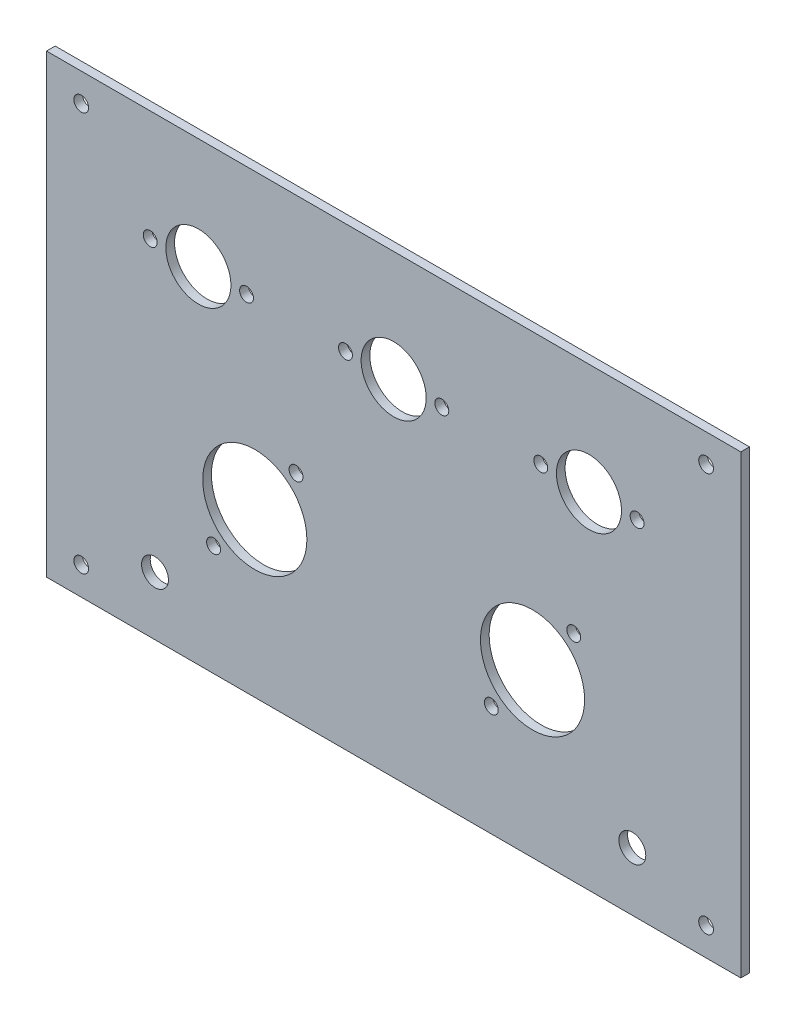
ISO-10303-21;
HEADER;
FILE_DESCRIPTION(('STEP AP214'),'2;1');
FILE_NAME('part.step','',(''),(''),'','','');
FILE_SCHEMA(('AUTOMOTIVE_DESIGN { 1 0 10303 214 1 1 1 1 }'));
ENDSEC;
DATA;
#1=APPLICATION_CONTEXT('core data for automotive mechanical design processes');
#2=APPLICATION_PROTOCOL_DEFINITION('international standard','automotive_design',2000,#1);
#3=PRODUCT_CONTEXT('',#1,'mechanical');
#4=PRODUCT('Part','Part','',(#3));
#5=PRODUCT_RELATED_PRODUCT_CATEGORY('part','',(#4));
#6=PRODUCT_DEFINITION_FORMATION('','',#4);
#7=PRODUCT_DEFINITION_CONTEXT('part definition',#1,'design');
#8=PRODUCT_DEFINITION('design','',#6,#7);
#9=PRODUCT_DEFINITION_SHAPE('','',#8);
#10=(LENGTH_UNIT() NAMED_UNIT(*) SI_UNIT(.MILLI.,.METRE.));
#11=(NAMED_UNIT(*) PLANE_ANGLE_UNIT() SI_UNIT($,.RADIAN.));
#12=(NAMED_UNIT(*) SI_UNIT($,.STERADIAN.) SOLID_ANGLE_UNIT());
#13=UNCERTAINTY_MEASURE_WITH_UNIT(LENGTH_MEASURE(1.E-05),#10,'distance_accuracy_value','');
#14=(GEOMETRIC_REPRESENTATION_CONTEXT(3) GLOBAL_UNCERTAINTY_ASSIGNED_CONTEXT((#13)) GLOBAL_UNIT_ASSIGNED_CONTEXT((#10,
#11,#12)) REPRESENTATION_CONTEXT('',''));
#15=CARTESIAN_POINT('',(0.,0.,0.));
#16=DIRECTION('',(0.,0.,1.));
#17=DIRECTION('',(1.,0.,0.));
#18=AXIS2_PLACEMENT_3D('',#15,#16,#17);
#19=CARTESIAN_POINT('',(0.,0.,2.));
#20=DIRECTION('',(0.,0.,1.));
#21=DIRECTION('',(1.,0.,0.));
#22=AXIS2_PLACEMENT_3D('',#19,#20,#21);
#23=PLANE('',#22);
#24=CARTESIAN_POINT('',(72.,46.,2.));
#25=DIRECTION('',(0.,0.,1.));
#26=DIRECTION('',(1.,0.,0.));
#27=AXIS2_PLACEMENT_3D('',#24,#25,#26);
#28=CIRCLE('',#27,1.7);
#29=CARTESIAN_POINT('',(73.7,46.,2.));
#30=VERTEX_POINT('',#29);
#31=EDGE_CURVE('E170',#30,#30,#28,.T.);
#32=ORIENTED_EDGE('',*,*,#31,.F.);
#33=EDGE_LOOP('',(#32));
#34=FACE_BOUND('',#33,.T.);
#35=CARTESIAN_POINT('',(72.,-46.,2.));
#36=DIRECTION('',(0.,0.,1.));
#37=DIRECTION('',(1.,0.,0.));
#38=AXIS2_PLACEMENT_3D('',#35,#36,#37);
#39=CIRCLE('',#38,1.7);
#40=CARTESIAN_POINT('',(73.7,-46.,2.));
#41=VERTEX_POINT('',#40);
#42=EDGE_CURVE('E167',#41,#41,#39,.T.);
#43=ORIENTED_EDGE('',*,*,#42,.F.);
#44=EDGE_LOOP('',(#43));
#45=FACE_BOUND('',#44,.T.);
#46=CARTESIAN_POINT('',(-72.,46.,2.));
#47=DIRECTION('',(0.,0.,1.));
#48=DIRECTION('',(1.,0.,0.));
#49=AXIS2_PLACEMENT_3D('',#46,#47,#48);
#50=CIRCLE('',#49,1.7);
#51=CARTESIAN_POINT('',(-70.3,46.,2.));
#52=VERTEX_POINT('',#51);
#53=EDGE_CURVE('E164',#52,#52,#50,.T.);
#54=ORIENTED_EDGE('',*,*,#53,.F.);
#55=EDGE_LOOP('',(#54));
#56=FACE_BOUND('',#55,.T.);
#57=CARTESIAN_POINT('',(-72.,-46.,2.));
#58=DIRECTION('',(0.,0.,1.));
#59=DIRECTION('',(1.,0.,0.));
#60=AXIS2_PLACEMENT_3D('',#57,#58,#59);
#61=CIRCLE('',#60,1.7);
#62=CARTESIAN_POINT('',(-70.3,-46.,2.));
#63=VERTEX_POINT('',#62);
#64=EDGE_CURVE('E160',#63,#63,#61,.T.);
#65=ORIENTED_EDGE('',*,*,#64,.F.);
#66=EDGE_LOOP('',(#65));
#67=FACE_BOUND('',#66,.T.);
#68=CARTESIAN_POINT('',(55.,-39.,2.));
#69=DIRECTION('',(0.,0.,1.));
#70=DIRECTION('',(1.,0.,0.));
#71=AXIS2_PLACEMENT_3D('',#68,#69,#70);
#72=CIRCLE('',#71,3.1);
#73=CARTESIAN_POINT('',(58.1,-39.,2.));
#74=VERTEX_POINT('',#73);
#75=EDGE_CURVE('E156',#74,#74,#72,.T.);
#76=ORIENTED_EDGE('',*,*,#75,.F.);
#77=EDGE_LOOP('',(#76));
#78=FACE_BOUND('',#77,.T.);
#79=CARTESIAN_POINT('',(-55.,-39.,2.));
#80=DIRECTION('',(0.,0.,1.));
#81=DIRECTION('',(1.,0.,0.));
#82=AXIS2_PLACEMENT_3D('',#79,#80,#81);
#83=CIRCLE('',#82,3.1);
#84=CARTESIAN_POINT('',(-51.9,-39.,2.));
#85=VERTEX_POINT('',#84);
#86=EDGE_CURVE('E152',#85,#85,#83,.T.);
#87=ORIENTED_EDGE('',*,*,#86,.F.);
#88=EDGE_LOOP('',(#87));
#89=FACE_BOUND('',#88,.T.);
#90=CARTESIAN_POINT('',(41.5,-3.,2.));
#91=DIRECTION('',(0.,0.,1.));
#92=DIRECTION('',(1.,0.,0.));
#93=AXIS2_PLACEMENT_3D('',#90,#91,#92);
#94=CIRCLE('',#93,1.6);
#95=CARTESIAN_POINT('',(43.1,-3.,2.));
#96=VERTEX_POINT('',#95);
#97=EDGE_CURVE('E148',#96,#96,#94,.T.);
#98=ORIENTED_EDGE('',*,*,#97,.F.);
#99=EDGE_LOOP('',(#98));
#100=FACE_BOUND('',#99,.T.);
#101=CARTESIAN_POINT('',(22.5,-27.,2.));
#102=DIRECTION('',(0.,0.,1.));
#103=DIRECTION('',(1.,0.,0.));
#104=AXIS2_PLACEMENT_3D('',#101,#102,#103);
#105=CIRCLE('',#104,1.6);
#106=CARTESIAN_POINT('',(24.1,-27.,2.));
#107=VERTEX_POINT('',#106);
#108=EDGE_CURVE('E144',#107,#107,#105,.T.);
#109=ORIENTED_EDGE('',*,*,#108,.F.);
#110=EDGE_LOOP('',(#109));
#111=FACE_BOUND('',#110,.T.);
#112=CARTESIAN_POINT('',(32.,-15.,2.));
#113=DIRECTION('',(0.,0.,1.));
#114=DIRECTION('',(1.,0.,0.));
#115=AXIS2_PLACEMENT_3D('',#112,#113,#114);
#116=CIRCLE('',#115,12.);
#117=CARTESIAN_POINT('',(44.,-15.,2.));
#118=VERTEX_POINT('',#117);
#119=EDGE_CURVE('E140',#118,#118,#116,.T.);
#120=ORIENTED_EDGE('',*,*,#119,.F.);
#121=EDGE_LOOP('',(#120));
#122=FACE_BOUND('',#121,.T.);
#123=CARTESIAN_POINT('',(-22.5,-3.,2.));
#124=DIRECTION('',(0.,0.,1.));
#125=DIRECTION('',(1.,0.,0.));
#126=AXIS2_PLACEMENT_3D('',#123,#124,#125);
#127=CIRCLE('',#126,1.6);
#128=CARTESIAN_POINT('',(-20.9,-3.,2.));
#129=VERTEX_POINT('',#128);
#130=EDGE_CURVE('E136',#129,#129,#127,.T.);
#131=ORIENTED_EDGE('',*,*,#130,.F.);
#132=EDGE_LOOP('',(#131));
#133=FACE_BOUND('',#132,.T.);
#134=CARTESIAN_POINT('',(-41.5,-27.,2.));
#135=DIRECTION('',(0.,0.,1.));
#136=DIRECTION('',(1.,0.,0.));
#137=AXIS2_PLACEMENT_3D('',#134,#135,#136);
#138=CIRCLE('',#137,1.6);
#139=CARTESIAN_POINT('',(-39.9,-27.,2.));
#140=VERTEX_POINT('',#139);
#141=EDGE_CURVE('E132',#140,#140,#138,.T.);
#142=ORIENTED_EDGE('',*,*,#141,.F.);
#143=EDGE_LOOP('',(#142));
#144=FACE_BOUND('',#143,.T.);
#145=CARTESIAN_POINT('',(-32.,-15.,2.));
#146=DIRECTION('',(0.,0.,1.));
#147=DIRECTION('',(1.,0.,0.));
#148=AXIS2_PLACEMENT_3D('',#145,#146,#147);
#149=CIRCLE('',#148,12.);
#150=CARTESIAN_POINT('',(-20.,-15.,2.));
#151=VERTEX_POINT('',#150);
#152=EDGE_CURVE('E128',#151,#151,#149,.T.);
#153=ORIENTED_EDGE('',*,*,#152,.F.);
#154=EDGE_LOOP('',(#153));
#155=FACE_BOUND('',#154,.T.);
#156=CARTESIAN_POINT('',(56.1,27.,2.));
#157=DIRECTION('',(0.,0.,1.));
#158=DIRECTION('',(1.,0.,0.));
#159=AXIS2_PLACEMENT_3D('',#156,#157,#158);
#160=CIRCLE('',#159,1.6);
#161=CARTESIAN_POINT('',(57.7,27.,2.));
#162=VERTEX_POINT('',#161);
#163=EDGE_CURVE('E124',#162,#162,#160,.T.);
#164=ORIENTED_EDGE('',*,*,#163,.F.);
#165=EDGE_LOOP('',(#164));
#166=FACE_BOUND('',#165,.T.);
#167=CARTESIAN_POINT('',(33.9,27.,2.));
#168=DIRECTION('',(0.,0.,1.));
#169=DIRECTION('',(1.,0.,0.));
#170=AXIS2_PLACEMENT_3D('',#167,#168,#169);
#171=CIRCLE('',#170,1.6);
#172=CARTESIAN_POINT('',(35.5,27.,2.));
#173=VERTEX_POINT('',#172);
#174=EDGE_CURVE('E120',#173,#173,#171,.T.);
#175=ORIENTED_EDGE('',*,*,#174,.F.);
#176=EDGE_LOOP('',(#175));
#177=FACE_BOUND('',#176,.T.);
#178=CARTESIAN_POINT('',(45.,27.,2.));
#179=DIRECTION('',(0.,0.,1.));
#180=DIRECTION('',(1.,0.,0.));
#181=AXIS2_PLACEMENT_3D('',#178,#179,#180);
#182=CIRCLE('',#181,7.5);
#183=CARTESIAN_POINT('',(52.5,27.,2.));
#184=VERTEX_POINT('',#183);
#185=EDGE_CURVE('E116',#184,#184,#182,.T.);
#186=ORIENTED_EDGE('',*,*,#185,.F.);
#187=EDGE_LOOP('',(#186));
#188=FACE_BOUND('',#187,.T.);
#189=CARTESIAN_POINT('',(11.1,27.,2.));
#190=DIRECTION('',(0.,0.,1.));
#191=DIRECTION('',(1.,0.,0.));
#192=AXIS2_PLACEMENT_3D('',#189,#190,#191);
#193=CIRCLE('',#192,1.6);
#194=CARTESIAN_POINT('',(12.7,27.,2.));
#195=VERTEX_POINT('',#194);
#196=EDGE_CURVE('E112',#195,#195,#193,.T.);
#197=ORIENTED_EDGE('',*,*,#196,.F.);
#198=EDGE_LOOP('',(#197));
#199=FACE_BOUND('',#198,.T.);
#200=CARTESIAN_POINT('',(-11.1,27.,2.));
#201=DIRECTION('',(0.,0.,1.));
#202=DIRECTION('',(1.,0.,0.));
#203=AXIS2_PLACEMENT_3D('',#200,#201,#202);
#204=CIRCLE('',#203,1.6);
#205=CARTESIAN_POINT('',(-9.5,27.,2.));
#206=VERTEX_POINT('',#205);
#207=EDGE_CURVE('E108',#206,#206,#204,.T.);
#208=ORIENTED_EDGE('',*,*,#207,.F.);
#209=EDGE_LOOP('',(#208));
#210=FACE_BOUND('',#209,.T.);
#211=CARTESIAN_POINT('',(0.,27.,2.));
#212=DIRECTION('',(0.,0.,1.));
#213=DIRECTION('',(1.,0.,0.));
#214=AXIS2_PLACEMENT_3D('',#211,#212,#213);
#215=CIRCLE('',#214,7.5);
#216=CARTESIAN_POINT('',(7.5,27.,2.));
#217=VERTEX_POINT('',#216);
#218=EDGE_CURVE('E104',#217,#217,#215,.T.);
#219=ORIENTED_EDGE('',*,*,#218,.F.);
#220=EDGE_LOOP('',(#219));
#221=FACE_BOUND('',#220,.T.);
#222=CARTESIAN_POINT('',(-33.9,27.,2.));
#223=DIRECTION('',(0.,0.,1.));
#224=DIRECTION('',(1.,0.,0.));
#225=AXIS2_PLACEMENT_3D('',#222,#223,#224);
#226=CIRCLE('',#225,1.6);
#227=CARTESIAN_POINT('',(-32.3,27.,2.));
#228=VERTEX_POINT('',#227);
#229=EDGE_CURVE('E100',#228,#228,#226,.T.);
#230=ORIENTED_EDGE('',*,*,#229,.F.);
#231=EDGE_LOOP('',(#230));
#232=FACE_BOUND('',#231,.T.);
#233=CARTESIAN_POINT('',(-56.1,27.,2.));
#234=DIRECTION('',(0.,0.,1.));
#235=DIRECTION('',(1.,0.,0.));
#236=AXIS2_PLACEMENT_3D('',#233,#234,#235);
#237=CIRCLE('',#236,1.6);
#238=CARTESIAN_POINT('',(-54.5,27.,2.));
#239=VERTEX_POINT('',#238);
#240=EDGE_CURVE('E96',#239,#239,#237,.T.);
#241=ORIENTED_EDGE('',*,*,#240,.F.);
#242=EDGE_LOOP('',(#241));
#243=FACE_BOUND('',#242,.T.);
#244=CARTESIAN_POINT('',(-45.,27.,2.));
#245=DIRECTION('',(0.,0.,1.));
#246=DIRECTION('',(1.,0.,0.));
#247=AXIS2_PLACEMENT_3D('',#244,#245,#246);
#248=CIRCLE('',#247,7.5);
#249=CARTESIAN_POINT('',(-37.5,27.,2.));
#250=VERTEX_POINT('',#249);
#251=EDGE_CURVE('E73',#250,#250,#248,.T.);
#252=ORIENTED_EDGE('',*,*,#251,.F.);
#253=EDGE_LOOP('',(#252));
#254=FACE_BOUND('',#253,.T.);
#255=DIRECTION('',(-1.,0.,0.));
#256=VECTOR('',#255,1.);
#257=CARTESIAN_POINT('',(0.,-52.5,2.));
#258=LINE('',#257,#256);
#259=CARTESIAN_POINT('',(80.,-52.5,2.));
#260=VERTEX_POINT('',#259);
#261=CARTESIAN_POINT('',(-80.,-52.5,2.));
#262=VERTEX_POINT('',#261);
#263=EDGE_CURVE('E10',#260,#262,#258,.T.);
#264=ORIENTED_EDGE('',*,*,#263,.F.);
#265=DIRECTION('',(0.,-1.,0.));
#266=VECTOR('',#265,1.);
#267=CARTESIAN_POINT('',(80.,0.,2.));
#268=LINE('',#267,#266);
#269=CARTESIAN_POINT('',(80.,52.5,2.));
#270=VERTEX_POINT('',#269);
#271=EDGE_CURVE('E62',#270,#260,#268,.T.);
#272=ORIENTED_EDGE('',*,*,#271,.F.);
#273=DIRECTION('',(1.,0.,0.));
#274=VECTOR('',#273,1.);
#275=CARTESIAN_POINT('',(0.,52.5,2.));
#276=LINE('',#275,#274);
#277=CARTESIAN_POINT('',(-80.,52.5,2.));
#278=VERTEX_POINT('',#277);
#279=EDGE_CURVE('E90',#278,#270,#276,.T.);
#280=ORIENTED_EDGE('',*,*,#279,.F.);
#281=DIRECTION('',(0.,1.,0.));
#282=VECTOR('',#281,1.);
#283=CARTESIAN_POINT('',(-80.,0.,2.));
#284=LINE('',#283,#282);
#285=EDGE_CURVE('E24',#262,#278,#284,.T.);
#286=ORIENTED_EDGE('',*,*,#285,.F.);
#287=EDGE_LOOP('',(#264,#272,#280,#286));
#288=FACE_BOUND('',#287,.T.);
#289=ADVANCED_FACE('F16',(#34,#45,#56,#67,#78,#89,#100,#111,#122,#133,#144,#155,#166,#177,#188,
#199,#210,#221,#232,#243,#254,#288),#23,.T.);
#290=CARTESIAN_POINT('',(0.,-52.5,0.));
#291=DIRECTION('',(0.,-1.,0.));
#292=DIRECTION('',(0.,0.,-1.));
#293=AXIS2_PLACEMENT_3D('',#290,#291,#292);
#294=PLANE('',#293);
#295=DIRECTION('',(0.,0.,1.));
#296=VECTOR('',#295,1.);
#297=CARTESIAN_POINT('',(80.,-52.5,0.));
#298=LINE('',#297,#296);
#299=CARTESIAN_POINT('',(80.,-52.5,0.));
#300=VERTEX_POINT('',#299);
#301=EDGE_CURVE('E55',#300,#260,#298,.T.);
#302=ORIENTED_EDGE('',*,*,#301,.T.);
#303=ORIENTED_EDGE('',*,*,#263,.T.);
#304=DIRECTION('',(0.,0.,1.));
#305=VECTOR('',#304,1.);
#306=CARTESIAN_POINT('',(-80.,-52.5,0.));
#307=LINE('',#306,#305);
#308=CARTESIAN_POINT('',(-80.,-52.5,0.));
#309=VERTEX_POINT('',#308);
#310=EDGE_CURVE('E68',#309,#262,#307,.T.);
#311=ORIENTED_EDGE('',*,*,#310,.F.);
#312=DIRECTION('',(1.,0.,0.));
#313=VECTOR('',#312,1.);
#314=CARTESIAN_POINT('',(0.,-52.5,0.));
#315=LINE('',#314,#313);
#316=EDGE_CURVE('E66',#309,#300,#315,.T.);
#317=ORIENTED_EDGE('',*,*,#316,.T.);
#318=EDGE_LOOP('',(#302,#303,#311,#317));
#319=FACE_BOUND('',#318,.T.);
#320=ADVANCED_FACE('F67',(#319),#294,.T.);
#321=CARTESIAN_POINT('',(-80.,0.,0.));
#322=DIRECTION('',(-1.,0.,0.));
#323=DIRECTION('',(0.,0.,1.));
#324=AXIS2_PLACEMENT_3D('',#321,#322,#323);
#325=PLANE('',#324);
#326=ORIENTED_EDGE('',*,*,#310,.T.);
#327=ORIENTED_EDGE('',*,*,#285,.T.);
#328=DIRECTION('',(0.,0.,1.));
#329=VECTOR('',#328,1.);
#330=CARTESIAN_POINT('',(-80.,52.5,0.));
#331=LINE('',#330,#329);
#332=CARTESIAN_POINT('',(-80.,52.5,0.));
#333=VERTEX_POINT('',#332);
#334=EDGE_CURVE('E85',#333,#278,#331,.T.);
#335=ORIENTED_EDGE('',*,*,#334,.F.);
#336=DIRECTION('',(0.,-1.,0.));
#337=VECTOR('',#336,1.);
#338=CARTESIAN_POINT('',(-80.,0.,0.));
#339=LINE('',#338,#337);
#340=EDGE_CURVE('E72',#333,#309,#339,.T.);
#341=ORIENTED_EDGE('',*,*,#340,.T.);
#342=EDGE_LOOP('',(#326,#327,#335,#341));
#343=FACE_BOUND('',#342,.T.);
#344=ADVANCED_FACE('F225',(#343),#325,.T.);
#345=CARTESIAN_POINT('',(0.,52.5,0.));
#346=DIRECTION('',(0.,1.,0.));
#347=DIRECTION('',(0.,0.,1.));
#348=AXIS2_PLACEMENT_3D('',#345,#346,#347);
#349=PLANE('',#348);
#350=ORIENTED_EDGE('',*,*,#334,.T.);
#351=ORIENTED_EDGE('',*,*,#279,.T.);
#352=DIRECTION('',(0.,0.,1.));
#353=VECTOR('',#352,1.);
#354=CARTESIAN_POINT('',(80.,52.5,0.));
#355=LINE('',#354,#353);
#356=CARTESIAN_POINT('',(80.,52.5,0.));
#357=VERTEX_POINT('',#356);
#358=EDGE_CURVE('E63',#357,#270,#355,.T.);
#359=ORIENTED_EDGE('',*,*,#358,.F.);
#360=DIRECTION('',(-1.,0.,0.));
#361=VECTOR('',#360,1.);
#362=CARTESIAN_POINT('',(0.,52.5,0.));
#363=LINE('',#362,#361);
#364=EDGE_CURVE('E78',#357,#333,#363,.T.);
#365=ORIENTED_EDGE('',*,*,#364,.T.);
#366=EDGE_LOOP('',(#350,#351,#359,#365));
#367=FACE_BOUND('',#366,.T.);
#368=ADVANCED_FACE('F227',(#367),#349,.T.);
#369=CARTESIAN_POINT('',(0.,0.,0.));
#370=DIRECTION('',(0.,0.,-1.));
#371=DIRECTION('',(-1.,0.,0.));
#372=AXIS2_PLACEMENT_3D('',#369,#370,#371);
#373=PLANE('',#372);
#374=CARTESIAN_POINT('',(72.,46.,0.));
#375=DIRECTION('',(0.,0.,-1.));
#376=DIRECTION('',(-1.,0.,0.));
#377=AXIS2_PLACEMENT_3D('',#374,#375,#376);
#378=CIRCLE('',#377,1.7);
#379=CARTESIAN_POINT('',(70.3,46.,0.));
#380=VERTEX_POINT('',#379);
#381=EDGE_CURVE('E19',#380,#380,#378,.T.);
#382=ORIENTED_EDGE('',*,*,#381,.F.);
#383=EDGE_LOOP('',(#382));
#384=FACE_BOUND('',#383,.T.);
#385=CARTESIAN_POINT('',(72.,-46.,0.));
#386=DIRECTION('',(0.,0.,-1.));
#387=DIRECTION('',(-1.,0.,0.));
#388=AXIS2_PLACEMENT_3D('',#385,#386,#387);
#389=CIRCLE('',#388,1.7);
#390=CARTESIAN_POINT('',(70.3,-46.,0.));
#391=VERTEX_POINT('',#390);
#392=EDGE_CURVE('E168',#391,#391,#389,.T.);
#393=ORIENTED_EDGE('',*,*,#392,.F.);
#394=EDGE_LOOP('',(#393));
#395=FACE_BOUND('',#394,.T.);
#396=CARTESIAN_POINT('',(-72.,46.,0.));
#397=DIRECTION('',(0.,0.,-1.));
#398=DIRECTION('',(-1.,0.,0.));
#399=AXIS2_PLACEMENT_3D('',#396,#397,#398);
#400=CIRCLE('',#399,1.7);
#401=CARTESIAN_POINT('',(-73.7,46.,0.));
#402=VERTEX_POINT('',#401);
#403=EDGE_CURVE('E165',#402,#402,#400,.T.);
#404=ORIENTED_EDGE('',*,*,#403,.F.);
#405=EDGE_LOOP('',(#404));
#406=FACE_BOUND('',#405,.T.);
#407=CARTESIAN_POINT('',(-72.,-46.,0.));
#408=DIRECTION('',(0.,0.,-1.));
#409=DIRECTION('',(-1.,0.,0.));
#410=AXIS2_PLACEMENT_3D('',#407,#408,#409);
#411=CIRCLE('',#410,1.7);
#412=CARTESIAN_POINT('',(-73.7,-46.,0.));
#413=VERTEX_POINT('',#412);
#414=EDGE_CURVE('E161',#413,#413,#411,.T.);
#415=ORIENTED_EDGE('',*,*,#414,.F.);
#416=EDGE_LOOP('',(#415));
#417=FACE_BOUND('',#416,.T.);
#418=CARTESIAN_POINT('',(55.,-39.,0.));
#419=DIRECTION('',(0.,0.,-1.));
#420=DIRECTION('',(-1.,0.,0.));
#421=AXIS2_PLACEMENT_3D('',#418,#419,#420);
#422=CIRCLE('',#421,3.1);
#423=CARTESIAN_POINT('',(51.9,-39.,0.));
#424=VERTEX_POINT('',#423);
#425=EDGE_CURVE('E157',#424,#424,#422,.T.);
#426=ORIENTED_EDGE('',*,*,#425,.F.);
#427=EDGE_LOOP('',(#426));
#428=FACE_BOUND('',#427,.T.);
#429=CARTESIAN_POINT('',(-55.,-39.,0.));
#430=DIRECTION('',(0.,0.,-1.));
#431=DIRECTION('',(-1.,0.,0.));
#432=AXIS2_PLACEMENT_3D('',#429,#430,#431);
#433=CIRCLE('',#432,3.1);
#434=CARTESIAN_POINT('',(-58.1,-39.,0.));
#435=VERTEX_POINT('',#434);
#436=EDGE_CURVE('E153',#435,#435,#433,.T.);
#437=ORIENTED_EDGE('',*,*,#436,.F.);
#438=EDGE_LOOP('',(#437));
#439=FACE_BOUND('',#438,.T.);
#440=CARTESIAN_POINT('',(41.5,-3.,0.));
#441=DIRECTION('',(0.,0.,-1.));
#442=DIRECTION('',(-1.,0.,0.));
#443=AXIS2_PLACEMENT_3D('',#440,#441,#442);
#444=CIRCLE('',#443,1.6);
#445=CARTESIAN_POINT('',(39.9,-3.,0.));
#446=VERTEX_POINT('',#445);
#447=EDGE_CURVE('E149',#446,#446,#444,.T.);
#448=ORIENTED_EDGE('',*,*,#447,.F.);
#449=EDGE_LOOP('',(#448));
#450=FACE_BOUND('',#449,.T.);
#451=CARTESIAN_POINT('',(22.5,-27.,0.));
#452=DIRECTION('',(0.,0.,-1.));
#453=DIRECTION('',(-1.,0.,0.));
#454=AXIS2_PLACEMENT_3D('',#451,#452,#453);
#455=CIRCLE('',#454,1.6);
#456=CARTESIAN_POINT('',(20.9,-27.,0.));
#457=VERTEX_POINT('',#456);
#458=EDGE_CURVE('E145',#457,#457,#455,.T.);
#459=ORIENTED_EDGE('',*,*,#458,.F.);
#460=EDGE_LOOP('',(#459));
#461=FACE_BOUND('',#460,.T.);
#462=CARTESIAN_POINT('',(32.,-15.,0.));
#463=DIRECTION('',(0.,0.,-1.));
#464=DIRECTION('',(-1.,0.,0.));
#465=AXIS2_PLACEMENT_3D('',#462,#463,#464);
#466=CIRCLE('',#465,12.);
#467=CARTESIAN_POINT('',(20.,-15.,0.));
#468=VERTEX_POINT('',#467);
#469=EDGE_CURVE('E141',#468,#468,#466,.T.);
#470=ORIENTED_EDGE('',*,*,#469,.F.);
#471=EDGE_LOOP('',(#470));
#472=FACE_BOUND('',#471,.T.);
#473=CARTESIAN_POINT('',(-22.5,-3.,0.));
#474=DIRECTION('',(0.,0.,-1.));
#475=DIRECTION('',(-1.,0.,0.));
#476=AXIS2_PLACEMENT_3D('',#473,#474,#475);
#477=CIRCLE('',#476,1.6);
#478=CARTESIAN_POINT('',(-24.1,-3.,0.));
#479=VERTEX_POINT('',#478);
#480=EDGE_CURVE('E137',#479,#479,#477,.T.);
#481=ORIENTED_EDGE('',*,*,#480,.F.);
#482=EDGE_LOOP('',(#481));
#483=FACE_BOUND('',#482,.T.);
#484=CARTESIAN_POINT('',(-41.5,-27.,0.));
#485=DIRECTION('',(0.,0.,-1.));
#486=DIRECTION('',(-1.,0.,0.));
#487=AXIS2_PLACEMENT_3D('',#484,#485,#486);
#488=CIRCLE('',#487,1.6);
#489=CARTESIAN_POINT('',(-43.1,-27.,0.));
#490=VERTEX_POINT('',#489);
#491=EDGE_CURVE('E133',#490,#490,#488,.T.);
#492=ORIENTED_EDGE('',*,*,#491,.F.);
#493=EDGE_LOOP('',(#492));
#494=FACE_BOUND('',#493,.T.);
#495=CARTESIAN_POINT('',(-32.,-15.,0.));
#496=DIRECTION('',(0.,0.,-1.));
#497=DIRECTION('',(-1.,0.,0.));
#498=AXIS2_PLACEMENT_3D('',#495,#496,#497);
#499=CIRCLE('',#498,12.);
#500=CARTESIAN_POINT('',(-44.,-15.,0.));
#501=VERTEX_POINT('',#500);
#502=EDGE_CURVE('E129',#501,#501,#499,.T.);
#503=ORIENTED_EDGE('',*,*,#502,.F.);
#504=EDGE_LOOP('',(#503));
#505=FACE_BOUND('',#504,.T.);
#506=CARTESIAN_POINT('',(56.1,27.,0.));
#507=DIRECTION('',(0.,0.,-1.));
#508=DIRECTION('',(-1.,0.,0.));
#509=AXIS2_PLACEMENT_3D('',#506,#507,#508);
#510=CIRCLE('',#509,1.6);
#511=CARTESIAN_POINT('',(54.5,27.,0.));
#512=VERTEX_POINT('',#511);
#513=EDGE_CURVE('E125',#512,#512,#510,.T.);
#514=ORIENTED_EDGE('',*,*,#513,.F.);
#515=EDGE_LOOP('',(#514));
#516=FACE_BOUND('',#515,.T.);
#517=CARTESIAN_POINT('',(33.9,27.,0.));
#518=DIRECTION('',(0.,0.,-1.));
#519=DIRECTION('',(-1.,0.,0.));
#520=AXIS2_PLACEMENT_3D('',#517,#518,#519);
#521=CIRCLE('',#520,1.6);
#522=CARTESIAN_POINT('',(32.3,27.,0.));
#523=VERTEX_POINT('',#522);
#524=EDGE_CURVE('E121',#523,#523,#521,.T.);
#525=ORIENTED_EDGE('',*,*,#524,.F.);
#526=EDGE_LOOP('',(#525));
#527=FACE_BOUND('',#526,.T.);
#528=CARTESIAN_POINT('',(45.,27.,0.));
#529=DIRECTION('',(0.,0.,-1.));
#530=DIRECTION('',(-1.,0.,0.));
#531=AXIS2_PLACEMENT_3D('',#528,#529,#530);
#532=CIRCLE('',#531,7.5);
#533=CARTESIAN_POINT('',(37.5,27.,0.));
#534=VERTEX_POINT('',#533);
#535=EDGE_CURVE('E117',#534,#534,#532,.T.);
#536=ORIENTED_EDGE('',*,*,#535,.F.);
#537=EDGE_LOOP('',(#536));
#538=FACE_BOUND('',#537,.T.);
#539=CARTESIAN_POINT('',(11.1,27.,0.));
#540=DIRECTION('',(0.,0.,-1.));
#541=DIRECTION('',(-1.,0.,0.));
#542=AXIS2_PLACEMENT_3D('',#539,#540,#541);
#543=CIRCLE('',#542,1.6);
#544=CARTESIAN_POINT('',(9.5,27.,0.));
#545=VERTEX_POINT('',#544);
#546=EDGE_CURVE('E113',#545,#545,#543,.T.);
#547=ORIENTED_EDGE('',*,*,#546,.F.);
#548=EDGE_LOOP('',(#547));
#549=FACE_BOUND('',#548,.T.);
#550=CARTESIAN_POINT('',(-11.1,27.,0.));
#551=DIRECTION('',(0.,0.,-1.));
#552=DIRECTION('',(-1.,0.,0.));
#553=AXIS2_PLACEMENT_3D('',#550,#551,#552);
#554=CIRCLE('',#553,1.6);
#555=CARTESIAN_POINT('',(-12.7,27.,0.));
#556=VERTEX_POINT('',#555);
#557=EDGE_CURVE('E109',#556,#556,#554,.T.);
#558=ORIENTED_EDGE('',*,*,#557,.F.);
#559=EDGE_LOOP('',(#558));
#560=FACE_BOUND('',#559,.T.);
#561=CARTESIAN_POINT('',(0.,27.,0.));
#562=DIRECTION('',(0.,0.,-1.));
#563=DIRECTION('',(-1.,0.,0.));
#564=AXIS2_PLACEMENT_3D('',#561,#562,#563);
#565=CIRCLE('',#564,7.5);
#566=CARTESIAN_POINT('',(-7.5,27.,0.));
#567=VERTEX_POINT('',#566);
#568=EDGE_CURVE('E105',#567,#567,#565,.T.);
#569=ORIENTED_EDGE('',*,*,#568,.F.);
#570=EDGE_LOOP('',(#569));
#571=FACE_BOUND('',#570,.T.);
#572=CARTESIAN_POINT('',(-33.9,27.,0.));
#573=DIRECTION('',(0.,0.,-1.));
#574=DIRECTION('',(-1.,0.,0.));
#575=AXIS2_PLACEMENT_3D('',#572,#573,#574);
#576=CIRCLE('',#575,1.6);
#577=CARTESIAN_POINT('',(-35.5,27.,0.));
#578=VERTEX_POINT('',#577);
#579=EDGE_CURVE('E101',#578,#578,#576,.T.);
#580=ORIENTED_EDGE('',*,*,#579,.F.);
#581=EDGE_LOOP('',(#580));
#582=FACE_BOUND('',#581,.T.);
#583=CARTESIAN_POINT('',(-56.1,27.,0.));
#584=DIRECTION('',(0.,0.,-1.));
#585=DIRECTION('',(-1.,0.,0.));
#586=AXIS2_PLACEMENT_3D('',#583,#584,#585);
#587=CIRCLE('',#586,1.6);
#588=CARTESIAN_POINT('',(-57.7,27.,0.));
#589=VERTEX_POINT('',#588);
#590=EDGE_CURVE('E97',#589,#589,#587,.T.);
#591=ORIENTED_EDGE('',*,*,#590,.F.);
#592=EDGE_LOOP('',(#591));
#593=FACE_BOUND('',#592,.T.);
#594=CARTESIAN_POINT('',(-45.,27.,0.));
#595=DIRECTION('',(0.,0.,-1.));
#596=DIRECTION('',(-1.,0.,0.));
#597=AXIS2_PLACEMENT_3D('',#594,#595,#596);
#598=CIRCLE('',#597,7.5);
#599=CARTESIAN_POINT('',(-52.5,27.,0.));
#600=VERTEX_POINT('',#599);
#601=EDGE_CURVE('E93',#600,#600,#598,.T.);
#602=ORIENTED_EDGE('',*,*,#601,.F.);
#603=EDGE_LOOP('',(#602));
#604=FACE_BOUND('',#603,.T.);
#605=DIRECTION('',(0.,1.,0.));
#606=VECTOR('',#605,1.);
#607=CARTESIAN_POINT('',(80.,0.,0.));
#608=LINE('',#607,#606);
#609=EDGE_CURVE('E60',#300,#357,#608,.T.);
#610=ORIENTED_EDGE('',*,*,#609,.F.);
#611=ORIENTED_EDGE('',*,*,#316,.F.);
#612=ORIENTED_EDGE('',*,*,#340,.F.);
#613=ORIENTED_EDGE('',*,*,#364,.F.);
#614=EDGE_LOOP('',(#610,#611,#612,#613));
#615=FACE_BOUND('',#614,.T.);
#616=ADVANCED_FACE('F76',(#384,#395,#406,#417,#428,#439,#450,#461,#472,#483,#494,#505,#516,#527,
#538,#549,#560,#571,#582,#593,#604,#615),#373,.T.);
#617=CARTESIAN_POINT('',(80.,0.,0.));
#618=DIRECTION('',(1.,0.,0.));
#619=DIRECTION('',(0.,0.,-1.));
#620=AXIS2_PLACEMENT_3D('',#617,#618,#619);
#621=PLANE('',#620);
#622=ORIENTED_EDGE('',*,*,#609,.T.);
#623=ORIENTED_EDGE('',*,*,#358,.T.);
#624=ORIENTED_EDGE('',*,*,#271,.T.);
#625=ORIENTED_EDGE('',*,*,#301,.F.);
#626=EDGE_LOOP('',(#622,#623,#624,#625));
#627=FACE_BOUND('',#626,.T.);
#628=ADVANCED_FACE('F57',(#627),#621,.T.);
#629=CARTESIAN_POINT('',(-45.,27.,-0.3));
#630=DIRECTION('',(0.,0.,1.));
#631=DIRECTION('',(1.,0.,0.));
#632=AXIS2_PLACEMENT_3D('',#629,#630,#631);
#633=CYLINDRICAL_SURFACE('',#632,7.5);
#634=ORIENTED_EDGE('',*,*,#251,.T.);
#635=EDGE_LOOP('',(#634));
#636=FACE_BOUND('',#635,.T.);
#637=ORIENTED_EDGE('',*,*,#601,.T.);
#638=EDGE_LOOP('',(#637));
#639=FACE_BOUND('',#638,.T.);
#640=ADVANCED_FACE('F219',(#636,#639),#633,.F.);
#641=CARTESIAN_POINT('',(-56.1,27.,-0.3));
#642=DIRECTION('',(0.,0.,1.));
#643=DIRECTION('',(1.,0.,0.));
#644=AXIS2_PLACEMENT_3D('',#641,#642,#643);
#645=CYLINDRICAL_SURFACE('',#644,1.6);
#646=ORIENTED_EDGE('',*,*,#240,.T.);
#647=EDGE_LOOP('',(#646));
#648=FACE_BOUND('',#647,.T.);
#649=ORIENTED_EDGE('',*,*,#590,.T.);
#650=EDGE_LOOP('',(#649));
#651=FACE_BOUND('',#650,.T.);
#652=ADVANCED_FACE('F282',(#648,#651),#645,.F.);
#653=CARTESIAN_POINT('',(-33.9,27.,-0.3));
#654=DIRECTION('',(0.,0.,1.));
#655=DIRECTION('',(1.,0.,0.));
#656=AXIS2_PLACEMENT_3D('',#653,#654,#655);
#657=CYLINDRICAL_SURFACE('',#656,1.6);
#658=ORIENTED_EDGE('',*,*,#229,.T.);
#659=EDGE_LOOP('',(#658));
#660=FACE_BOUND('',#659,.T.);
#661=ORIENTED_EDGE('',*,*,#579,.T.);
#662=EDGE_LOOP('',(#661));
#663=FACE_BOUND('',#662,.T.);
#664=ADVANCED_FACE('F291',(#660,#663),#657,.F.);
#665=CARTESIAN_POINT('',(0.,27.,-0.3));
#666=DIRECTION('',(0.,0.,1.));
#667=DIRECTION('',(1.,0.,0.));
#668=AXIS2_PLACEMENT_3D('',#665,#666,#667);
#669=CYLINDRICAL_SURFACE('',#668,7.5);
#670=ORIENTED_EDGE('',*,*,#218,.T.);
#671=EDGE_LOOP('',(#670));
#672=FACE_BOUND('',#671,.T.);
#673=ORIENTED_EDGE('',*,*,#568,.T.);
#674=EDGE_LOOP('',(#673));
#675=FACE_BOUND('',#674,.T.);
#676=ADVANCED_FACE('F301',(#672,#675),#669,.F.);
#677=CARTESIAN_POINT('',(-11.1,27.,-0.3));
#678=DIRECTION('',(0.,0.,1.));
#679=DIRECTION('',(1.,0.,0.));
#680=AXIS2_PLACEMENT_3D('',#677,#678,#679);
#681=CYLINDRICAL_SURFACE('',#680,1.6);
#682=ORIENTED_EDGE('',*,*,#207,.T.);
#683=EDGE_LOOP('',(#682));
#684=FACE_BOUND('',#683,.T.);
#685=ORIENTED_EDGE('',*,*,#557,.T.);
#686=EDGE_LOOP('',(#685));
#687=FACE_BOUND('',#686,.T.);
#688=ADVANCED_FACE('F311',(#684,#687),#681,.F.);
#689=CARTESIAN_POINT('',(11.1,27.,-0.3));
#690=DIRECTION('',(0.,0.,1.));
#691=DIRECTION('',(1.,0.,0.));
#692=AXIS2_PLACEMENT_3D('',#689,#690,#691);
#693=CYLINDRICAL_SURFACE('',#692,1.6);
#694=ORIENTED_EDGE('',*,*,#196,.T.);
#695=EDGE_LOOP('',(#694));
#696=FACE_BOUND('',#695,.T.);
#697=ORIENTED_EDGE('',*,*,#546,.T.);
#698=EDGE_LOOP('',(#697));
#699=FACE_BOUND('',#698,.T.);
#700=ADVANCED_FACE('F321',(#696,#699),#693,.F.);
#701=CARTESIAN_POINT('',(45.,27.,-0.3));
#702=DIRECTION('',(0.,0.,1.));
#703=DIRECTION('',(1.,0.,0.));
#704=AXIS2_PLACEMENT_3D('',#701,#702,#703);
#705=CYLINDRICAL_SURFACE('',#704,7.5);
#706=ORIENTED_EDGE('',*,*,#185,.T.);
#707=EDGE_LOOP('',(#706));
#708=FACE_BOUND('',#707,.T.);
#709=ORIENTED_EDGE('',*,*,#535,.T.);
#710=EDGE_LOOP('',(#709));
#711=FACE_BOUND('',#710,.T.);
#712=ADVANCED_FACE('F331',(#708,#711),#705,.F.);
#713=CARTESIAN_POINT('',(33.9,27.,-0.3));
#714=DIRECTION('',(0.,0.,1.));
#715=DIRECTION('',(1.,0.,0.));
#716=AXIS2_PLACEMENT_3D('',#713,#714,#715);
#717=CYLINDRICAL_SURFACE('',#716,1.6);
#718=ORIENTED_EDGE('',*,*,#174,.T.);
#719=EDGE_LOOP('',(#718));
#720=FACE_BOUND('',#719,.T.);
#721=ORIENTED_EDGE('',*,*,#524,.T.);
#722=EDGE_LOOP('',(#721));
#723=FACE_BOUND('',#722,.T.);
#724=ADVANCED_FACE('F341',(#720,#723),#717,.F.);
#725=CARTESIAN_POINT('',(56.1,27.,-0.3));
#726=DIRECTION('',(0.,0.,1.));
#727=DIRECTION('',(1.,0.,0.));
#728=AXIS2_PLACEMENT_3D('',#725,#726,#727);
#729=CYLINDRICAL_SURFACE('',#728,1.6);
#730=ORIENTED_EDGE('',*,*,#163,.T.);
#731=EDGE_LOOP('',(#730));
#732=FACE_BOUND('',#731,.T.);
#733=ORIENTED_EDGE('',*,*,#513,.T.);
#734=EDGE_LOOP('',(#733));
#735=FACE_BOUND('',#734,.T.);
#736=ADVANCED_FACE('F351',(#732,#735),#729,.F.);
#737=CARTESIAN_POINT('',(-32.,-15.,-0.3));
#738=DIRECTION('',(0.,0.,1.));
#739=DIRECTION('',(1.,0.,0.));
#740=AXIS2_PLACEMENT_3D('',#737,#738,#739);
#741=CYLINDRICAL_SURFACE('',#740,12.);
#742=ORIENTED_EDGE('',*,*,#152,.T.);
#743=EDGE_LOOP('',(#742));
#744=FACE_BOUND('',#743,.T.);
#745=ORIENTED_EDGE('',*,*,#502,.T.);
#746=EDGE_LOOP('',(#745));
#747=FACE_BOUND('',#746,.T.);
#748=ADVANCED_FACE('F361',(#744,#747),#741,.F.);
#749=CARTESIAN_POINT('',(-41.5,-27.,-0.3));
#750=DIRECTION('',(0.,0.,1.));
#751=DIRECTION('',(1.,0.,0.));
#752=AXIS2_PLACEMENT_3D('',#749,#750,#751);
#753=CYLINDRICAL_SURFACE('',#752,1.6);
#754=ORIENTED_EDGE('',*,*,#141,.T.);
#755=EDGE_LOOP('',(#754));
#756=FACE_BOUND('',#755,.T.);
#757=ORIENTED_EDGE('',*,*,#491,.T.);
#758=EDGE_LOOP('',(#757));
#759=FACE_BOUND('',#758,.T.);
#760=ADVANCED_FACE('F371',(#756,#759),#753,.F.);
#761=CARTESIAN_POINT('',(-22.5,-3.,-0.3));
#762=DIRECTION('',(0.,0.,1.));
#763=DIRECTION('',(1.,0.,0.));
#764=AXIS2_PLACEMENT_3D('',#761,#762,#763);
#765=CYLINDRICAL_SURFACE('',#764,1.6);
#766=ORIENTED_EDGE('',*,*,#130,.T.);
#767=EDGE_LOOP('',(#766));
#768=FACE_BOUND('',#767,.T.);
#769=ORIENTED_EDGE('',*,*,#480,.T.);
#770=EDGE_LOOP('',(#769));
#771=FACE_BOUND('',#770,.T.);
#772=ADVANCED_FACE('F381',(#768,#771),#765,.F.);
#773=CARTESIAN_POINT('',(32.,-15.,-0.3));
#774=DIRECTION('',(0.,0.,1.));
#775=DIRECTION('',(1.,0.,0.));
#776=AXIS2_PLACEMENT_3D('',#773,#774,#775);
#777=CYLINDRICAL_SURFACE('',#776,12.);
#778=ORIENTED_EDGE('',*,*,#119,.T.);
#779=EDGE_LOOP('',(#778));
#780=FACE_BOUND('',#779,.T.);
#781=ORIENTED_EDGE('',*,*,#469,.T.);
#782=EDGE_LOOP('',(#781));
#783=FACE_BOUND('',#782,.T.);
#784=ADVANCED_FACE('F391',(#780,#783),#777,.F.);
#785=CARTESIAN_POINT('',(22.5,-27.,-0.3));
#786=DIRECTION('',(0.,0.,1.));
#787=DIRECTION('',(1.,0.,0.));
#788=AXIS2_PLACEMENT_3D('',#785,#786,#787);
#789=CYLINDRICAL_SURFACE('',#788,1.6);
#790=ORIENTED_EDGE('',*,*,#108,.T.);
#791=EDGE_LOOP('',(#790));
#792=FACE_BOUND('',#791,.T.);
#793=ORIENTED_EDGE('',*,*,#458,.T.);
#794=EDGE_LOOP('',(#793));
#795=FACE_BOUND('',#794,.T.);
#796=ADVANCED_FACE('F401',(#792,#795),#789,.F.);
#797=CARTESIAN_POINT('',(41.5,-3.,-0.3));
#798=DIRECTION('',(0.,0.,1.));
#799=DIRECTION('',(1.,0.,0.));
#800=AXIS2_PLACEMENT_3D('',#797,#798,#799);
#801=CYLINDRICAL_SURFACE('',#800,1.6);
#802=ORIENTED_EDGE('',*,*,#97,.T.);
#803=EDGE_LOOP('',(#802));
#804=FACE_BOUND('',#803,.T.);
#805=ORIENTED_EDGE('',*,*,#447,.T.);
#806=EDGE_LOOP('',(#805));
#807=FACE_BOUND('',#806,.T.);
#808=ADVANCED_FACE('F411',(#804,#807),#801,.F.);
#809=CARTESIAN_POINT('',(-55.,-39.,-0.3));
#810=DIRECTION('',(0.,0.,1.));
#811=DIRECTION('',(1.,0.,0.));
#812=AXIS2_PLACEMENT_3D('',#809,#810,#811);
#813=CYLINDRICAL_SURFACE('',#812,3.1);
#814=ORIENTED_EDGE('',*,*,#86,.T.);
#815=EDGE_LOOP('',(#814));
#816=FACE_BOUND('',#815,.T.);
#817=ORIENTED_EDGE('',*,*,#436,.T.);
#818=EDGE_LOOP('',(#817));
#819=FACE_BOUND('',#818,.T.);
#820=ADVANCED_FACE('F421',(#816,#819),#813,.F.);
#821=CARTESIAN_POINT('',(55.,-39.,-0.3));
#822=DIRECTION('',(0.,0.,1.));
#823=DIRECTION('',(1.,0.,0.));
#824=AXIS2_PLACEMENT_3D('',#821,#822,#823);
#825=CYLINDRICAL_SURFACE('',#824,3.1);
#826=ORIENTED_EDGE('',*,*,#75,.T.);
#827=EDGE_LOOP('',(#826));
#828=FACE_BOUND('',#827,.T.);
#829=ORIENTED_EDGE('',*,*,#425,.T.);
#830=EDGE_LOOP('',(#829));
#831=FACE_BOUND('',#830,.T.);
#832=ADVANCED_FACE('F431',(#828,#831),#825,.F.);
#833=CARTESIAN_POINT('',(-72.,-46.,-0.3));
#834=DIRECTION('',(0.,0.,1.));
#835=DIRECTION('',(1.,0.,0.));
#836=AXIS2_PLACEMENT_3D('',#833,#834,#835);
#837=CYLINDRICAL_SURFACE('',#836,1.7);
#838=ORIENTED_EDGE('',*,*,#64,.T.);
#839=EDGE_LOOP('',(#838));
#840=FACE_BOUND('',#839,.T.);
#841=ORIENTED_EDGE('',*,*,#414,.T.);
#842=EDGE_LOOP('',(#841));
#843=FACE_BOUND('',#842,.T.);
#844=ADVANCED_FACE('F441',(#840,#843),#837,.F.);
#845=CARTESIAN_POINT('',(-72.,46.,-0.3));
#846=DIRECTION('',(0.,0.,1.));
#847=DIRECTION('',(1.,0.,0.));
#848=AXIS2_PLACEMENT_3D('',#845,#846,#847);
#849=CYLINDRICAL_SURFACE('',#848,1.7);
#850=ORIENTED_EDGE('',*,*,#53,.T.);
#851=EDGE_LOOP('',(#850));
#852=FACE_BOUND('',#851,.T.);
#853=ORIENTED_EDGE('',*,*,#403,.T.);
#854=EDGE_LOOP('',(#853));
#855=FACE_BOUND('',#854,.T.);
#856=ADVANCED_FACE('F451',(#852,#855),#849,.F.);
#857=CARTESIAN_POINT('',(72.,-46.,-0.3));
#858=DIRECTION('',(0.,0.,1.));
#859=DIRECTION('',(1.,0.,0.));
#860=AXIS2_PLACEMENT_3D('',#857,#858,#859);
#861=CYLINDRICAL_SURFACE('',#860,1.7);
#862=ORIENTED_EDGE('',*,*,#42,.T.);
#863=EDGE_LOOP('',(#862));
#864=FACE_BOUND('',#863,.T.);
#865=ORIENTED_EDGE('',*,*,#392,.T.);
#866=EDGE_LOOP('',(#865));
#867=FACE_BOUND('',#866,.T.);
#868=ADVANCED_FACE('F461',(#864,#867),#861,.F.);
#869=CARTESIAN_POINT('',(72.,46.,-0.3));
#870=DIRECTION('',(0.,0.,1.));
#871=DIRECTION('',(1.,0.,0.));
#872=AXIS2_PLACEMENT_3D('',#869,#870,#871);
#873=CYLINDRICAL_SURFACE('',#872,1.7);
#874=ORIENTED_EDGE('',*,*,#31,.T.);
#875=EDGE_LOOP('',(#874));
#876=FACE_BOUND('',#875,.T.);
#877=ORIENTED_EDGE('',*,*,#381,.T.);
#878=EDGE_LOOP('',(#877));
#879=FACE_BOUND('',#878,.T.);
#880=ADVANCED_FACE('F471',(#876,#879),#873,.F.);
#881=CLOSED_SHELL('',(#289,#320,#344,#368,#616,#628,#640,#652,#664,#676,#688,#700,#712,#724,
#736,#748,#760,#772,#784,#796,#808,#820,#832,#844,#856,#868,#880));
#882=MANIFOLD_SOLID_BREP('B1',#881);
#883=ADVANCED_BREP_SHAPE_REPRESENTATION('',(#18,#882),#14);
#884=SHAPE_DEFINITION_REPRESENTATION(#9,#883);
ENDSEC;
END-ISO-10303-21;
